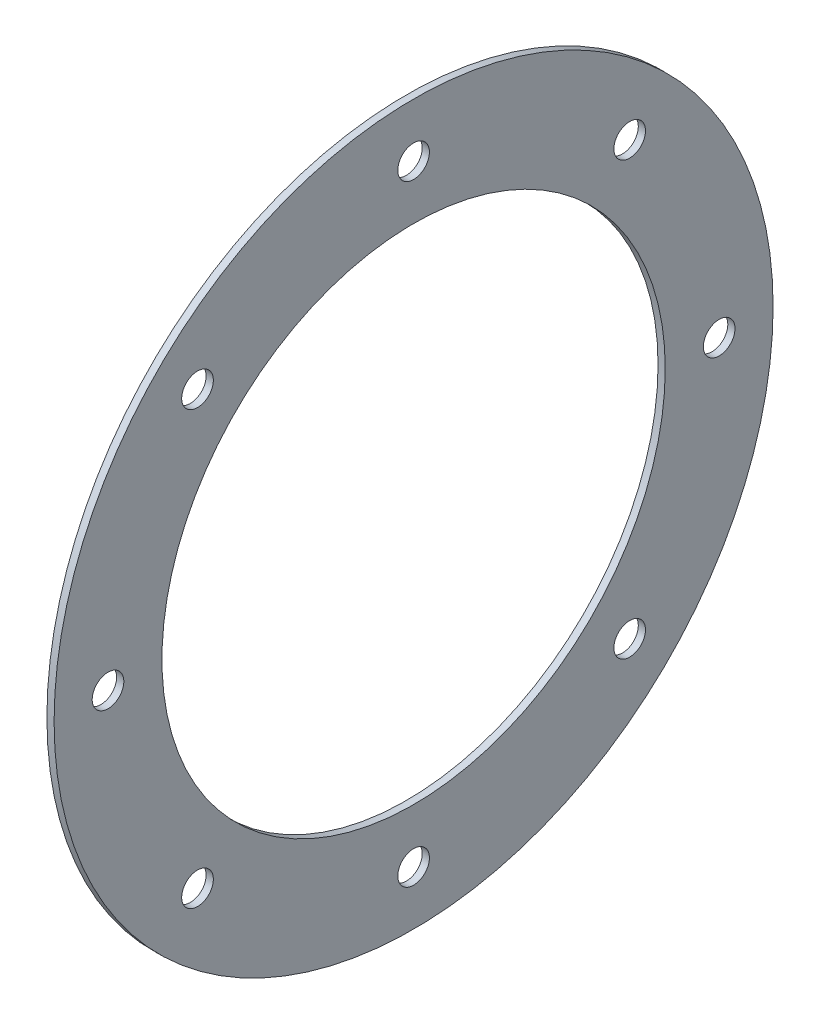
ISO-10303-21;
HEADER;
FILE_DESCRIPTION(('STEP AP214'),'2;1');
FILE_NAME('part.step','',(''),(''),'','','');
FILE_SCHEMA(('AUTOMOTIVE_DESIGN { 1 0 10303 214 1 1 1 1 }'));
ENDSEC;
DATA;
#1=APPLICATION_CONTEXT('core data for automotive mechanical design processes');
#2=APPLICATION_PROTOCOL_DEFINITION('international standard','automotive_design',2000,#1);
#3=PRODUCT_CONTEXT('',#1,'mechanical');
#4=PRODUCT('Part','Part','',(#3));
#5=PRODUCT_RELATED_PRODUCT_CATEGORY('part','',(#4));
#6=PRODUCT_DEFINITION_FORMATION('','',#4);
#7=PRODUCT_DEFINITION_CONTEXT('part definition',#1,'design');
#8=PRODUCT_DEFINITION('design','',#6,#7);
#9=PRODUCT_DEFINITION_SHAPE('','',#8);
#10=(LENGTH_UNIT() NAMED_UNIT(*) SI_UNIT(.MILLI.,.METRE.));
#11=(NAMED_UNIT(*) PLANE_ANGLE_UNIT() SI_UNIT($,.RADIAN.));
#12=(NAMED_UNIT(*) SI_UNIT($,.STERADIAN.) SOLID_ANGLE_UNIT());
#13=UNCERTAINTY_MEASURE_WITH_UNIT(LENGTH_MEASURE(1.E-05),#10,'distance_accuracy_value','');
#14=(GEOMETRIC_REPRESENTATION_CONTEXT(3) GLOBAL_UNCERTAINTY_ASSIGNED_CONTEXT((#13)) GLOBAL_UNIT_ASSIGNED_CONTEXT((#10,
#11,#12)) REPRESENTATION_CONTEXT('',''));
#15=CARTESIAN_POINT('',(0.,0.,0.));
#16=DIRECTION('',(0.,0.,1.));
#17=DIRECTION('',(1.,0.,0.));
#18=AXIS2_PLACEMENT_3D('',#15,#16,#17);
#19=CARTESIAN_POINT('',(2.00000000000022,0.,2.22044604925031E-13));
#20=DIRECTION('',(1.,0.,0.));
#21=DIRECTION('',(0.,0.,-1.));
#22=AXIS2_PLACEMENT_3D('',#19,#20,#21);
#23=PLANE('',#22);
#24=CARTESIAN_POINT('',(1.99999999999984,-3.09465994496883E-11,84.9999999999689));
#25=DIRECTION('',(1.,0.,0.));
#26=DIRECTION('',(0.,0.,-1.));
#27=AXIS2_PLACEMENT_3D('',#24,#25,#26);
#28=CIRCLE('',#27,4.4);
#29=CARTESIAN_POINT('',(1.99999999999983,-3.09465994496883E-11,80.5999999999689));
#30=VERTEX_POINT('',#29);
#31=EDGE_CURVE('E104',#30,#30,#28,.T.);
#32=ORIENTED_EDGE('',*,*,#31,.F.);
#33=EDGE_LOOP('',(#32));
#34=FACE_BOUND('',#33,.T.);
#35=CARTESIAN_POINT('',(2.00000000000028,-85.,-6.19504447740837E-11));
#36=DIRECTION('',(1.,0.,0.));
#37=DIRECTION('',(0.,0.,-1.));
#38=AXIS2_PLACEMENT_3D('',#35,#36,#37);
#39=CIRCLE('',#38,4.4);
#40=CARTESIAN_POINT('',(2.00000000000028,-85.,-4.40000000006195));
#41=VERTEX_POINT('',#40);
#42=EDGE_CURVE('E90',#41,#41,#39,.T.);
#43=ORIENTED_EDGE('',*,*,#42,.F.);
#44=EDGE_LOOP('',(#43));
#45=FACE_BOUND('',#44,.T.);
#46=CARTESIAN_POINT('',(1.99999999999984,3.09396605557843E-11,-85.0000000000309));
#47=DIRECTION('',(1.,0.,0.));
#48=DIRECTION('',(0.,0.,-1.));
#49=AXIS2_PLACEMENT_3D('',#46,#47,#48);
#50=CIRCLE('',#49,4.4);
#51=CARTESIAN_POINT('',(1.99999999999983,3.09396605557843E-11,-89.4000000000309));
#52=VERTEX_POINT('',#51);
#53=EDGE_CURVE('E71',#52,#52,#50,.T.);
#54=ORIENTED_EDGE('',*,*,#53,.F.);
#55=EDGE_LOOP('',(#54));
#56=FACE_BOUND('',#55,.T.);
#57=CARTESIAN_POINT('',(2.00000000000072,85.,-2.22044604925031E-13));
#58=DIRECTION('',(1.,0.,0.));
#59=DIRECTION('',(0.,0.,-1.));
#60=AXIS2_PLACEMENT_3D('',#57,#58,#59);
#61=CIRCLE('',#60,4.4);
#62=CARTESIAN_POINT('',(2.00000000000072,85.,-4.40000000000022));
#63=VERTEX_POINT('',#62);
#64=EDGE_CURVE('E60',#63,#63,#61,.T.);
#65=ORIENTED_EDGE('',*,*,#64,.F.);
#66=EDGE_LOOP('',(#65));
#67=FACE_BOUND('',#66,.T.);
#68=CARTESIAN_POINT('',(2.00000000000022,0.,2.22044604925031E-13));
#69=DIRECTION('',(1.,0.,0.));
#70=DIRECTION('',(0.,0.,-1.));
#71=AXIS2_PLACEMENT_3D('',#68,#69,#70);
#72=CIRCLE('',#71,100.);
#73=CARTESIAN_POINT('',(2.00000000000022,0.,-99.9999999999998));
#74=VERTEX_POINT('',#73);
#75=EDGE_CURVE('E10',#74,#74,#72,.T.);
#76=ORIENTED_EDGE('',*,*,#75,.T.);
#77=EDGE_LOOP('',(#76));
#78=FACE_BOUND('',#77,.T.);
#79=CARTESIAN_POINT('',(2.00000000000022,0.,2.22044604925031E-13));
#80=DIRECTION('',(1.,0.,0.));
#81=DIRECTION('',(0.,0.,-1.));
#82=AXIS2_PLACEMENT_3D('',#79,#80,#81);
#83=CIRCLE('',#82,70.);
#84=CARTESIAN_POINT('',(2.00000000000022,0.,-69.9999999999998));
#85=VERTEX_POINT('',#84);
#86=EDGE_CURVE('E51',#85,#85,#83,.T.);
#87=ORIENTED_EDGE('',*,*,#86,.F.);
#88=EDGE_LOOP('',(#87));
#89=FACE_BOUND('',#88,.T.);
#90=CARTESIAN_POINT('',(1.99999999999978,60.1040764008784,-60.1040764008655));
#91=DIRECTION('',(1.,0.,0.));
#92=DIRECTION('',(0.,0.,-1.));
#93=AXIS2_PLACEMENT_3D('',#90,#91,#92);
#94=CIRCLE('',#93,4.39999999999999);
#95=CARTESIAN_POINT('',(1.99999999999978,60.1040764008784,-64.5040764008655));
#96=VERTEX_POINT('',#95);
#97=EDGE_CURVE('E64',#96,#96,#94,.T.);
#98=ORIENTED_EDGE('',*,*,#97,.F.);
#99=EDGE_LOOP('',(#98));
#100=FACE_BOUND('',#99,.T.);
#101=CARTESIAN_POINT('',(1.99999999999978,-60.1040764008347,-60.1040764009095));
#102=DIRECTION('',(1.,0.,0.));
#103=DIRECTION('',(0.,0.,-1.));
#104=AXIS2_PLACEMENT_3D('',#101,#102,#103);
#105=CIRCLE('',#104,4.4);
#106=CARTESIAN_POINT('',(1.99999999999978,-60.1040764008347,-64.5040764009096));
#107=VERTEX_POINT('',#106);
#108=EDGE_CURVE('E83',#107,#107,#105,.T.);
#109=ORIENTED_EDGE('',*,*,#108,.F.);
#110=EDGE_LOOP('',(#109));
#111=FACE_BOUND('',#110,.T.);
#112=CARTESIAN_POINT('',(1.99999999999984,-60.1040764008784,60.1040764008036));
#113=DIRECTION('',(1.,0.,0.));
#114=DIRECTION('',(0.,0.,-1.));
#115=AXIS2_PLACEMENT_3D('',#112,#113,#114);
#116=CIRCLE('',#115,4.4);
#117=CARTESIAN_POINT('',(1.99999999999983,-60.1040764008784,55.7040764008036));
#118=VERTEX_POINT('',#117);
#119=EDGE_CURVE('E100',#118,#118,#116,.T.);
#120=ORIENTED_EDGE('',*,*,#119,.F.);
#121=EDGE_LOOP('',(#120));
#122=FACE_BOUND('',#121,.T.);
#123=CARTESIAN_POINT('',(2.00000000000022,60.1040764008347,60.1040764008478));
#124=DIRECTION('',(1.,0.,0.));
#125=DIRECTION('',(0.,0.,-1.));
#126=AXIS2_PLACEMENT_3D('',#123,#124,#125);
#127=CIRCLE('',#126,4.4);
#128=CARTESIAN_POINT('',(2.00000000000022,60.1040764008347,55.7040764008478));
#129=VERTEX_POINT('',#128);
#130=EDGE_CURVE('E114',#129,#129,#127,.T.);
#131=ORIENTED_EDGE('',*,*,#130,.F.);
#132=EDGE_LOOP('',(#131));
#133=FACE_BOUND('',#132,.T.);
#134=ADVANCED_FACE('F40',(#34,#45,#56,#67,#78,#89,#100,#111,#122,#133),#23,.T.);
#135=CARTESIAN_POINT('',(0.,0.,0.));
#136=DIRECTION('',(1.,0.,0.));
#137=DIRECTION('',(0.,0.,-1.));
#138=AXIS2_PLACEMENT_3D('',#135,#136,#137);
#139=PLANE('',#138);
#140=CARTESIAN_POINT('',(0.,0.,0.));
#141=DIRECTION('',(1.,0.,0.));
#142=DIRECTION('',(0.,0.,-1.));
#143=AXIS2_PLACEMENT_3D('',#140,#141,#142);
#144=CIRCLE('',#143,100.);
#145=CARTESIAN_POINT('',(0.,0.,-100.));
#146=VERTEX_POINT('',#145);
#147=EDGE_CURVE('E41',#146,#146,#144,.T.);
#148=ORIENTED_EDGE('',*,*,#147,.F.);
#149=EDGE_LOOP('',(#148));
#150=FACE_BOUND('',#149,.T.);
#151=CARTESIAN_POINT('',(0.,0.,0.));
#152=DIRECTION('',(1.,0.,0.));
#153=DIRECTION('',(0.,0.,-1.));
#154=AXIS2_PLACEMENT_3D('',#151,#152,#153);
#155=CIRCLE('',#154,70.);
#156=CARTESIAN_POINT('',(0.,0.,-70.));
#157=VERTEX_POINT('',#156);
#158=EDGE_CURVE('E52',#157,#157,#155,.T.);
#159=ORIENTED_EDGE('',*,*,#158,.T.);
#160=EDGE_LOOP('',(#159));
#161=FACE_BOUND('',#160,.T.);
#162=CARTESIAN_POINT('',(0.,85.,0.));
#163=DIRECTION('',(1.,0.,0.));
#164=DIRECTION('',(0.,0.,-1.));
#165=AXIS2_PLACEMENT_3D('',#162,#163,#164);
#166=CIRCLE('',#165,4.4);
#167=CARTESIAN_POINT('',(0.,85.,-4.4));
#168=VERTEX_POINT('',#167);
#169=EDGE_CURVE('E61',#168,#168,#166,.T.);
#170=ORIENTED_EDGE('',*,*,#169,.T.);
#171=EDGE_LOOP('',(#170));
#172=FACE_BOUND('',#171,.T.);
#173=CARTESIAN_POINT('',(0.,60.1040764008784,-60.1040764008656));
#174=DIRECTION('',(1.,0.,0.));
#175=DIRECTION('',(0.,0.,-1.));
#176=AXIS2_PLACEMENT_3D('',#173,#174,#175);
#177=CIRCLE('',#176,4.39999999999999);
#178=CARTESIAN_POINT('',(0.,60.1040764008784,-64.5040764008656));
#179=VERTEX_POINT('',#178);
#180=EDGE_CURVE('E67',#179,#179,#177,.T.);
#181=ORIENTED_EDGE('',*,*,#180,.T.);
#182=EDGE_LOOP('',(#181));
#183=FACE_BOUND('',#182,.T.);
#184=CARTESIAN_POINT('',(0.,3.09396605557843E-11,-85.0000000000308));
#185=DIRECTION('',(1.,0.,0.));
#186=DIRECTION('',(0.,0.,-1.));
#187=AXIS2_PLACEMENT_3D('',#184,#185,#186);
#188=CIRCLE('',#187,4.4);
#189=CARTESIAN_POINT('',(0.,3.09396605557843E-11,-89.4000000000308));
#190=VERTEX_POINT('',#189);
#191=EDGE_CURVE('E80',#190,#190,#188,.T.);
#192=ORIENTED_EDGE('',*,*,#191,.T.);
#193=EDGE_LOOP('',(#192));
#194=FACE_BOUND('',#193,.T.);
#195=CARTESIAN_POINT('',(0.,-60.1040764008347,-60.1040764009089));
#196=DIRECTION('',(1.,0.,0.));
#197=DIRECTION('',(0.,0.,-1.));
#198=AXIS2_PLACEMENT_3D('',#195,#196,#197);
#199=CIRCLE('',#198,4.4);
#200=CARTESIAN_POINT('',(0.,-60.1040764008347,-64.5040764009089));
#201=VERTEX_POINT('',#200);
#202=EDGE_CURVE('E84',#201,#201,#199,.T.);
#203=ORIENTED_EDGE('',*,*,#202,.T.);
#204=EDGE_LOOP('',(#203));
#205=FACE_BOUND('',#204,.T.);
#206=CARTESIAN_POINT('',(0.,-85.,-6.21447338033931E-11));
#207=DIRECTION('',(1.,0.,0.));
#208=DIRECTION('',(0.,0.,-1.));
#209=AXIS2_PLACEMENT_3D('',#206,#207,#208);
#210=CIRCLE('',#209,4.4);
#211=CARTESIAN_POINT('',(0.,-85.,-4.40000000006214));
#212=VERTEX_POINT('',#211);
#213=EDGE_CURVE('E91',#212,#212,#210,.T.);
#214=ORIENTED_EDGE('',*,*,#213,.T.);
#215=EDGE_LOOP('',(#214));
#216=FACE_BOUND('',#215,.T.);
#217=CARTESIAN_POINT('',(0.,-60.1040764008784,60.1040764008036));
#218=DIRECTION('',(1.,0.,0.));
#219=DIRECTION('',(0.,0.,-1.));
#220=AXIS2_PLACEMENT_3D('',#217,#218,#219);
#221=CIRCLE('',#220,4.4);
#222=CARTESIAN_POINT('',(0.,-60.1040764008784,55.7040764008036));
#223=VERTEX_POINT('',#222);
#224=EDGE_CURVE('E101',#223,#223,#221,.T.);
#225=ORIENTED_EDGE('',*,*,#224,.T.);
#226=EDGE_LOOP('',(#225));
#227=FACE_BOUND('',#226,.T.);
#228=CARTESIAN_POINT('',(0.,-3.09465994496883E-11,84.9999999999684));
#229=DIRECTION('',(1.,0.,0.));
#230=DIRECTION('',(0.,0.,-1.));
#231=AXIS2_PLACEMENT_3D('',#228,#229,#230);
#232=CIRCLE('',#231,4.4);
#233=CARTESIAN_POINT('',(0.,-3.09465994496883E-11,80.5999999999684));
#234=VERTEX_POINT('',#233);
#235=EDGE_CURVE('E108',#234,#234,#232,.T.);
#236=ORIENTED_EDGE('',*,*,#235,.T.);
#237=EDGE_LOOP('',(#236));
#238=FACE_BOUND('',#237,.T.);
#239=CARTESIAN_POINT('',(0.,60.1040764008347,60.1040764008474));
#240=DIRECTION('',(1.,0.,0.));
#241=DIRECTION('',(0.,0.,-1.));
#242=AXIS2_PLACEMENT_3D('',#239,#240,#241);
#243=CIRCLE('',#242,4.4);
#244=CARTESIAN_POINT('',(0.,60.1040764008347,55.7040764008474));
#245=VERTEX_POINT('',#244);
#246=EDGE_CURVE('E120',#245,#245,#243,.T.);
#247=ORIENTED_EDGE('',*,*,#246,.T.);
#248=EDGE_LOOP('',(#247));
#249=FACE_BOUND('',#248,.T.);
#250=ADVANCED_FACE('F128',(#150,#161,#172,#183,#194,#205,#216,#227,#238,#249),#139,.F.);
#251=CARTESIAN_POINT('',(2.00000000000022,0.,2.22044604925031E-13));
#252=DIRECTION('',(-1.,0.,0.));
#253=DIRECTION('',(0.,0.,1.));
#254=AXIS2_PLACEMENT_3D('',#251,#252,#253);
#255=CYLINDRICAL_SURFACE('',#254,100.);
#256=ORIENTED_EDGE('',*,*,#75,.F.);
#257=EDGE_LOOP('',(#256));
#258=FACE_BOUND('',#257,.T.);
#259=ORIENTED_EDGE('',*,*,#147,.T.);
#260=EDGE_LOOP('',(#259));
#261=FACE_BOUND('',#260,.T.);
#262=ADVANCED_FACE('F39',(#258,#261),#255,.T.);
#263=CARTESIAN_POINT('',(2.00000000000022,0.,2.22044604925031E-13));
#264=DIRECTION('',(-1.,0.,0.));
#265=DIRECTION('',(0.,0.,1.));
#266=AXIS2_PLACEMENT_3D('',#263,#264,#265);
#267=CYLINDRICAL_SURFACE('',#266,70.);
#268=ORIENTED_EDGE('',*,*,#86,.T.);
#269=EDGE_LOOP('',(#268));
#270=FACE_BOUND('',#269,.T.);
#271=ORIENTED_EDGE('',*,*,#158,.F.);
#272=EDGE_LOOP('',(#271));
#273=FACE_BOUND('',#272,.T.);
#274=ADVANCED_FACE('F143',(#270,#273),#267,.F.);
#275=CARTESIAN_POINT('',(2.00000000000072,85.,-2.22044604925031E-13));
#276=DIRECTION('',(-1.,0.,0.));
#277=DIRECTION('',(0.,0.,1.));
#278=AXIS2_PLACEMENT_3D('',#275,#276,#277);
#279=CYLINDRICAL_SURFACE('',#278,4.4);
#280=ORIENTED_EDGE('',*,*,#64,.T.);
#281=EDGE_LOOP('',(#280));
#282=FACE_BOUND('',#281,.T.);
#283=ORIENTED_EDGE('',*,*,#169,.F.);
#284=EDGE_LOOP('',(#283));
#285=FACE_BOUND('',#284,.T.);
#286=ADVANCED_FACE('F145',(#282,#285),#279,.F.);
#287=CARTESIAN_POINT('',(1.99999999999978,60.1040764008784,-60.1040764008655));
#288=DIRECTION('',(-1.,0.,0.));
#289=DIRECTION('',(0.,0.,1.));
#290=AXIS2_PLACEMENT_3D('',#287,#288,#289);
#291=CYLINDRICAL_SURFACE('',#290,4.39999999999999);
#292=ORIENTED_EDGE('',*,*,#97,.T.);
#293=EDGE_LOOP('',(#292));
#294=FACE_BOUND('',#293,.T.);
#295=ORIENTED_EDGE('',*,*,#180,.F.);
#296=EDGE_LOOP('',(#295));
#297=FACE_BOUND('',#296,.T.);
#298=ADVANCED_FACE('F146',(#294,#297),#291,.F.);
#299=CARTESIAN_POINT('',(1.99999999999984,3.09396605557843E-11,-85.0000000000309));
#300=DIRECTION('',(-1.,0.,0.));
#301=DIRECTION('',(0.,0.,1.));
#302=AXIS2_PLACEMENT_3D('',#299,#300,#301);
#303=CYLINDRICAL_SURFACE('',#302,4.4);
#304=ORIENTED_EDGE('',*,*,#53,.T.);
#305=EDGE_LOOP('',(#304));
#306=FACE_BOUND('',#305,.T.);
#307=ORIENTED_EDGE('',*,*,#191,.F.);
#308=EDGE_LOOP('',(#307));
#309=FACE_BOUND('',#308,.T.);
#310=ADVANCED_FACE('F155',(#306,#309),#303,.F.);
#311=CARTESIAN_POINT('',(1.99999999999978,-60.1040764008347,-60.1040764009095));
#312=DIRECTION('',(-1.,0.,0.));
#313=DIRECTION('',(0.,0.,1.));
#314=AXIS2_PLACEMENT_3D('',#311,#312,#313);
#315=CYLINDRICAL_SURFACE('',#314,4.4);
#316=ORIENTED_EDGE('',*,*,#108,.T.);
#317=EDGE_LOOP('',(#316));
#318=FACE_BOUND('',#317,.T.);
#319=ORIENTED_EDGE('',*,*,#202,.F.);
#320=EDGE_LOOP('',(#319));
#321=FACE_BOUND('',#320,.T.);
#322=ADVANCED_FACE('F156',(#318,#321),#315,.F.);
#323=CARTESIAN_POINT('',(2.00000000000028,-85.,-6.19504447740837E-11));
#324=DIRECTION('',(-1.,0.,0.));
#325=DIRECTION('',(0.,0.,1.));
#326=AXIS2_PLACEMENT_3D('',#323,#324,#325);
#327=CYLINDRICAL_SURFACE('',#326,4.4);
#328=ORIENTED_EDGE('',*,*,#42,.T.);
#329=EDGE_LOOP('',(#328));
#330=FACE_BOUND('',#329,.T.);
#331=ORIENTED_EDGE('',*,*,#213,.F.);
#332=EDGE_LOOP('',(#331));
#333=FACE_BOUND('',#332,.T.);
#334=ADVANCED_FACE('F159',(#330,#333),#327,.F.);
#335=CARTESIAN_POINT('',(1.99999999999984,-60.1040764008784,60.1040764008036));
#336=DIRECTION('',(-1.,0.,0.));
#337=DIRECTION('',(0.,0.,1.));
#338=AXIS2_PLACEMENT_3D('',#335,#336,#337);
#339=CYLINDRICAL_SURFACE('',#338,4.4);
#340=ORIENTED_EDGE('',*,*,#119,.T.);
#341=EDGE_LOOP('',(#340));
#342=FACE_BOUND('',#341,.T.);
#343=ORIENTED_EDGE('',*,*,#224,.F.);
#344=EDGE_LOOP('',(#343));
#345=FACE_BOUND('',#344,.T.);
#346=ADVANCED_FACE('F163',(#342,#345),#339,.F.);
#347=CARTESIAN_POINT('',(1.99999999999984,-3.09465994496883E-11,84.9999999999689));
#348=DIRECTION('',(-1.,0.,0.));
#349=DIRECTION('',(0.,0.,1.));
#350=AXIS2_PLACEMENT_3D('',#347,#348,#349);
#351=CYLINDRICAL_SURFACE('',#350,4.4);
#352=ORIENTED_EDGE('',*,*,#31,.T.);
#353=EDGE_LOOP('',(#352));
#354=FACE_BOUND('',#353,.T.);
#355=ORIENTED_EDGE('',*,*,#235,.F.);
#356=EDGE_LOOP('',(#355));
#357=FACE_BOUND('',#356,.T.);
#358=ADVANCED_FACE('F169',(#354,#357),#351,.F.);
#359=CARTESIAN_POINT('',(2.00000000000022,60.1040764008347,60.1040764008478));
#360=DIRECTION('',(-1.,0.,0.));
#361=DIRECTION('',(0.,0.,1.));
#362=AXIS2_PLACEMENT_3D('',#359,#360,#361);
#363=CYLINDRICAL_SURFACE('',#362,4.4);
#364=ORIENTED_EDGE('',*,*,#130,.T.);
#365=EDGE_LOOP('',(#364));
#366=FACE_BOUND('',#365,.T.);
#367=ORIENTED_EDGE('',*,*,#246,.F.);
#368=EDGE_LOOP('',(#367));
#369=FACE_BOUND('',#368,.T.);
#370=ADVANCED_FACE('F127',(#366,#369),#363,.F.);
#371=CLOSED_SHELL('',(#134,#250,#262,#274,#286,#298,#310,#322,#334,#346,#358,#370));
#372=MANIFOLD_SOLID_BREP('B2',#371);
#373=ADVANCED_BREP_SHAPE_REPRESENTATION('',(#18,#372),#14);
#374=SHAPE_DEFINITION_REPRESENTATION(#9,#373);
ENDSEC;
END-ISO-10303-21;
